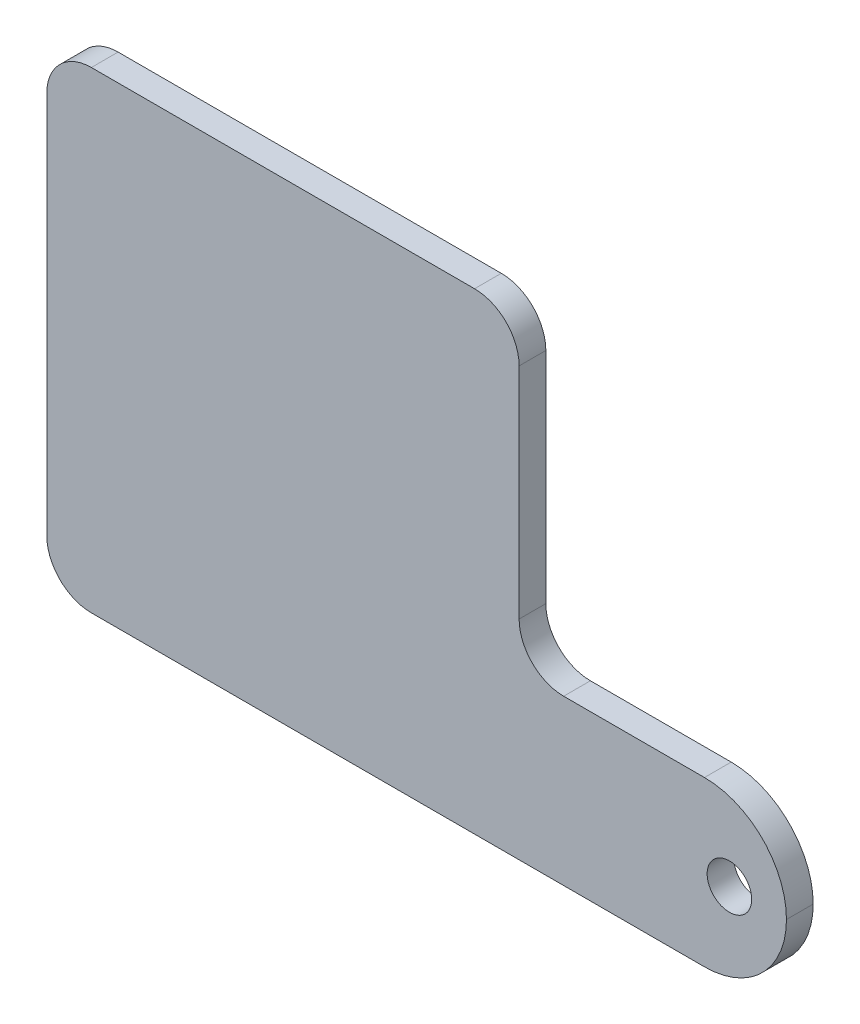
ISO-10303-21;
HEADER;
FILE_DESCRIPTION(('STEP AP214'),'2;1');
FILE_NAME('part.step','',(''),(''),'','','');
FILE_SCHEMA(('AUTOMOTIVE_DESIGN { 1 0 10303 214 1 1 1 1 }'));
ENDSEC;
DATA;
#1=APPLICATION_CONTEXT('core data for automotive mechanical design processes');
#2=APPLICATION_PROTOCOL_DEFINITION('international standard','automotive_design',2000,#1);
#3=PRODUCT_CONTEXT('',#1,'mechanical');
#4=PRODUCT('Part','Part','',(#3));
#5=PRODUCT_RELATED_PRODUCT_CATEGORY('part','',(#4));
#6=PRODUCT_DEFINITION_FORMATION('','',#4);
#7=PRODUCT_DEFINITION_CONTEXT('part definition',#1,'design');
#8=PRODUCT_DEFINITION('design','',#6,#7);
#9=PRODUCT_DEFINITION_SHAPE('','',#8);
#10=(LENGTH_UNIT() NAMED_UNIT(*) SI_UNIT(.MILLI.,.METRE.));
#11=(NAMED_UNIT(*) PLANE_ANGLE_UNIT() SI_UNIT($,.RADIAN.));
#12=(NAMED_UNIT(*) SI_UNIT($,.STERADIAN.) SOLID_ANGLE_UNIT());
#13=UNCERTAINTY_MEASURE_WITH_UNIT(LENGTH_MEASURE(1.E-05),#10,'distance_accuracy_value','');
#14=(GEOMETRIC_REPRESENTATION_CONTEXT(3) GLOBAL_UNCERTAINTY_ASSIGNED_CONTEXT((#13)) GLOBAL_UNIT_ASSIGNED_CONTEXT((#10,
#11,#12)) REPRESENTATION_CONTEXT('',''));
#15=CARTESIAN_POINT('',(0.,0.,0.));
#16=DIRECTION('',(0.,0.,1.));
#17=DIRECTION('',(1.,0.,0.));
#18=AXIS2_PLACEMENT_3D('',#15,#16,#17);
#19=CARTESIAN_POINT('',(0.,0.,3.));
#20=DIRECTION('',(0.,0.,-1.));
#21=DIRECTION('',(-1.,0.,0.));
#22=AXIS2_PLACEMENT_3D('',#19,#20,#21);
#23=PLANE('',#22);
#24=DIRECTION('',(1.,0.,0.));
#25=VECTOR('',#24,1.);
#26=CARTESIAN_POINT('',(0.,0.,3.));
#27=LINE('',#26,#25);
#28=CARTESIAN_POINT('',(5.,0.,3.));
#29=VERTEX_POINT('',#28);
#30=CARTESIAN_POINT('',(73.8,0.,3.));
#31=VERTEX_POINT('',#30);
#32=EDGE_CURVE('E200',#29,#31,#27,.T.);
#33=ORIENTED_EDGE('',*,*,#32,.T.);
#34=CARTESIAN_POINT('',(73.8,9.2,3.));
#35=DIRECTION('',(0.,0.,-1.));
#36=DIRECTION('',(-1.,0.,0.));
#37=AXIS2_PLACEMENT_3D('',#34,#35,#36);
#38=CIRCLE('',#37,9.2);
#39=CARTESIAN_POINT('',(83.,9.2,3.));
#40=VERTEX_POINT('',#39);
#41=EDGE_CURVE('E42',#31,#40,#38,.F.);
#42=ORIENTED_EDGE('',*,*,#41,.T.);
#43=CARTESIAN_POINT('',(73.8,9.2,3.));
#44=DIRECTION('',(0.,0.,-1.));
#45=DIRECTION('',(-1.,0.,0.));
#46=AXIS2_PLACEMENT_3D('',#43,#44,#45);
#47=CIRCLE('',#46,9.2);
#48=CARTESIAN_POINT('',(73.8,18.4,3.));
#49=VERTEX_POINT('',#48);
#50=EDGE_CURVE('E49',#40,#49,#47,.F.);
#51=ORIENTED_EDGE('',*,*,#50,.T.);
#52=DIRECTION('',(-1.,0.,0.));
#53=VECTOR('',#52,1.);
#54=CARTESIAN_POINT('',(53.,18.4,3.));
#55=LINE('',#54,#53);
#56=CARTESIAN_POINT('',(58.,18.4,3.));
#57=VERTEX_POINT('',#56);
#58=EDGE_CURVE('E206',#49,#57,#55,.T.);
#59=ORIENTED_EDGE('',*,*,#58,.T.);
#60=CARTESIAN_POINT('',(58.,23.4,3.));
#61=DIRECTION('',(0.,0.,-1.));
#62=DIRECTION('',(-1.,0.,0.));
#63=AXIS2_PLACEMENT_3D('',#60,#61,#62);
#64=CIRCLE('',#63,5.);
#65=CARTESIAN_POINT('',(53.,23.4,3.));
#66=VERTEX_POINT('',#65);
#67=EDGE_CURVE('E186',#57,#66,#64,.T.);
#68=ORIENTED_EDGE('',*,*,#67,.T.);
#69=DIRECTION('',(0.,1.,0.));
#70=VECTOR('',#69,1.);
#71=CARTESIAN_POINT('',(53.,53.,3.));
#72=LINE('',#71,#70);
#73=CARTESIAN_POINT('',(53.,48.,3.));
#74=VERTEX_POINT('',#73);
#75=EDGE_CURVE('E208',#66,#74,#72,.T.);
#76=ORIENTED_EDGE('',*,*,#75,.T.);
#77=CARTESIAN_POINT('',(48.,48.,3.));
#78=DIRECTION('',(0.,0.,-1.));
#79=DIRECTION('',(-1.,0.,0.));
#80=AXIS2_PLACEMENT_3D('',#77,#78,#79);
#81=CIRCLE('',#80,5.);
#82=CARTESIAN_POINT('',(48.,53.,3.));
#83=VERTEX_POINT('',#82);
#84=EDGE_CURVE('E165',#74,#83,#81,.F.);
#85=ORIENTED_EDGE('',*,*,#84,.T.);
#86=DIRECTION('',(-1.,0.,0.));
#87=VECTOR('',#86,1.);
#88=CARTESIAN_POINT('',(0.,53.,3.));
#89=LINE('',#88,#87);
#90=CARTESIAN_POINT('',(5.,53.,3.));
#91=VERTEX_POINT('',#90);
#92=EDGE_CURVE('E150',#83,#91,#89,.T.);
#93=ORIENTED_EDGE('',*,*,#92,.T.);
#94=CARTESIAN_POINT('',(5.,48.,3.));
#95=DIRECTION('',(0.,0.,-1.));
#96=DIRECTION('',(-1.,0.,0.));
#97=AXIS2_PLACEMENT_3D('',#94,#95,#96);
#98=CIRCLE('',#97,5.);
#99=CARTESIAN_POINT('',(0.,48.,3.));
#100=VERTEX_POINT('',#99);
#101=EDGE_CURVE('E169',#91,#100,#98,.F.);
#102=ORIENTED_EDGE('',*,*,#101,.T.);
#103=DIRECTION('',(0.,-1.,0.));
#104=VECTOR('',#103,1.);
#105=CARTESIAN_POINT('',(0.,0.,3.));
#106=LINE('',#105,#104);
#107=CARTESIAN_POINT('',(0.,5.,3.));
#108=VERTEX_POINT('',#107);
#109=EDGE_CURVE('E133',#100,#108,#106,.T.);
#110=ORIENTED_EDGE('',*,*,#109,.T.);
#111=CARTESIAN_POINT('',(5.,5.,3.));
#112=DIRECTION('',(0.,0.,-1.));
#113=DIRECTION('',(-1.,0.,0.));
#114=AXIS2_PLACEMENT_3D('',#111,#112,#113);
#115=CIRCLE('',#114,5.);
#116=EDGE_CURVE('E167',#108,#29,#115,.F.);
#117=ORIENTED_EDGE('',*,*,#116,.T.);
#118=EDGE_LOOP('',(#33,#42,#51,#59,#68,#76,#85,#93,#102,#110,#117));
#119=FACE_BOUND('',#118,.T.);
#120=CARTESIAN_POINT('',(76.6,9.2,3.));
#121=DIRECTION('',(0.,0.,1.));
#122=DIRECTION('',(1.,0.,0.));
#123=AXIS2_PLACEMENT_3D('',#120,#121,#122);
#124=CIRCLE('',#123,2.5);
#125=CARTESIAN_POINT('',(79.1,9.2,3.));
#126=VERTEX_POINT('',#125);
#127=EDGE_CURVE('E141',#126,#126,#124,.T.);
#128=ORIENTED_EDGE('',*,*,#127,.F.);
#129=EDGE_LOOP('',(#128));
#130=FACE_BOUND('',#129,.T.);
#131=ADVANCED_FACE('F33',(#119,#130),#23,.F.);
#132=CARTESIAN_POINT('',(0.,0.,0.));
#133=DIRECTION('',(0.,0.,-1.));
#134=DIRECTION('',(-1.,0.,0.));
#135=AXIS2_PLACEMENT_3D('',#132,#133,#134);
#136=PLANE('',#135);
#137=CARTESIAN_POINT('',(73.8,9.2,0.));
#138=DIRECTION('',(0.,0.,-1.));
#139=DIRECTION('',(-1.,0.,0.));
#140=AXIS2_PLACEMENT_3D('',#137,#138,#139);
#141=CIRCLE('',#140,9.2);
#142=CARTESIAN_POINT('',(73.8,18.4,0.));
#143=VERTEX_POINT('',#142);
#144=CARTESIAN_POINT('',(83.,9.2,0.));
#145=VERTEX_POINT('',#144);
#146=EDGE_CURVE('E188',#143,#145,#141,.T.);
#147=ORIENTED_EDGE('',*,*,#146,.T.);
#148=CARTESIAN_POINT('',(73.8,9.2,0.));
#149=DIRECTION('',(0.,0.,-1.));
#150=DIRECTION('',(-1.,0.,0.));
#151=AXIS2_PLACEMENT_3D('',#148,#149,#150);
#152=CIRCLE('',#151,9.2);
#153=CARTESIAN_POINT('',(73.8,0.,0.));
#154=VERTEX_POINT('',#153);
#155=EDGE_CURVE('E190',#145,#154,#152,.T.);
#156=ORIENTED_EDGE('',*,*,#155,.T.);
#157=DIRECTION('',(1.,0.,0.));
#158=VECTOR('',#157,1.);
#159=CARTESIAN_POINT('',(0.,0.,0.));
#160=LINE('',#159,#158);
#161=CARTESIAN_POINT('',(5.,0.,0.));
#162=VERTEX_POINT('',#161);
#163=EDGE_CURVE('E140',#162,#154,#160,.T.);
#164=ORIENTED_EDGE('',*,*,#163,.F.);
#165=CARTESIAN_POINT('',(5.,5.,0.));
#166=DIRECTION('',(0.,0.,-1.));
#167=DIRECTION('',(-1.,0.,0.));
#168=AXIS2_PLACEMENT_3D('',#165,#166,#167);
#169=CIRCLE('',#168,5.);
#170=CARTESIAN_POINT('',(0.,5.,0.));
#171=VERTEX_POINT('',#170);
#172=EDGE_CURVE('E124',#162,#171,#169,.T.);
#173=ORIENTED_EDGE('',*,*,#172,.T.);
#174=DIRECTION('',(0.,-1.,0.));
#175=VECTOR('',#174,1.);
#176=CARTESIAN_POINT('',(0.,0.,0.));
#177=LINE('',#176,#175);
#178=CARTESIAN_POINT('',(0.,48.,0.));
#179=VERTEX_POINT('',#178);
#180=EDGE_CURVE('E130',#179,#171,#177,.T.);
#181=ORIENTED_EDGE('',*,*,#180,.F.);
#182=CARTESIAN_POINT('',(5.,48.,0.));
#183=DIRECTION('',(0.,0.,-1.));
#184=DIRECTION('',(-1.,0.,0.));
#185=AXIS2_PLACEMENT_3D('',#182,#183,#184);
#186=CIRCLE('',#185,5.);
#187=CARTESIAN_POINT('',(5.,53.,0.));
#188=VERTEX_POINT('',#187);
#189=EDGE_CURVE('E113',#179,#188,#186,.T.);
#190=ORIENTED_EDGE('',*,*,#189,.T.);
#191=DIRECTION('',(-1.,0.,0.));
#192=VECTOR('',#191,1.);
#193=CARTESIAN_POINT('',(0.,53.,0.));
#194=LINE('',#193,#192);
#195=CARTESIAN_POINT('',(48.,53.,0.));
#196=VERTEX_POINT('',#195);
#197=EDGE_CURVE('E156',#196,#188,#194,.T.);
#198=ORIENTED_EDGE('',*,*,#197,.F.);
#199=CARTESIAN_POINT('',(48.,48.,0.));
#200=DIRECTION('',(0.,0.,-1.));
#201=DIRECTION('',(-1.,0.,0.));
#202=AXIS2_PLACEMENT_3D('',#199,#200,#201);
#203=CIRCLE('',#202,5.);
#204=CARTESIAN_POINT('',(53.,48.,0.));
#205=VERTEX_POINT('',#204);
#206=EDGE_CURVE('E134',#196,#205,#203,.T.);
#207=ORIENTED_EDGE('',*,*,#206,.T.);
#208=DIRECTION('',(0.,1.,0.));
#209=VECTOR('',#208,1.);
#210=CARTESIAN_POINT('',(53.,53.,0.));
#211=LINE('',#210,#209);
#212=CARTESIAN_POINT('',(53.,23.4,0.));
#213=VERTEX_POINT('',#212);
#214=EDGE_CURVE('E154',#213,#205,#211,.T.);
#215=ORIENTED_EDGE('',*,*,#214,.F.);
#216=CARTESIAN_POINT('',(58.,23.4,0.));
#217=DIRECTION('',(0.,0.,-1.));
#218=DIRECTION('',(-1.,0.,0.));
#219=AXIS2_PLACEMENT_3D('',#216,#217,#218);
#220=CIRCLE('',#219,5.);
#221=CARTESIAN_POINT('',(58.,18.4,0.));
#222=VERTEX_POINT('',#221);
#223=EDGE_CURVE('E183',#213,#222,#220,.F.);
#224=ORIENTED_EDGE('',*,*,#223,.T.);
#225=DIRECTION('',(-1.,0.,0.));
#226=VECTOR('',#225,1.);
#227=CARTESIAN_POINT('',(53.,18.4,0.));
#228=LINE('',#227,#226);
#229=EDGE_CURVE('E144',#143,#222,#228,.T.);
#230=ORIENTED_EDGE('',*,*,#229,.F.);
#231=EDGE_LOOP('',(#147,#156,#164,#173,#181,#190,#198,#207,#215,#224,#230));
#232=FACE_BOUND('',#231,.T.);
#233=CARTESIAN_POINT('',(76.6,9.2,0.));
#234=DIRECTION('',(0.,0.,1.));
#235=DIRECTION('',(1.,0.,0.));
#236=AXIS2_PLACEMENT_3D('',#233,#234,#235);
#237=CIRCLE('',#236,2.5);
#238=CARTESIAN_POINT('',(79.1,9.2,0.));
#239=VERTEX_POINT('',#238);
#240=EDGE_CURVE('E147',#239,#239,#237,.T.);
#241=ORIENTED_EDGE('',*,*,#240,.T.);
#242=EDGE_LOOP('',(#241));
#243=FACE_BOUND('',#242,.T.);
#244=ADVANCED_FACE('F137',(#232,#243),#136,.T.);
#245=CARTESIAN_POINT('',(0.,0.,3.));
#246=DIRECTION('',(1.,0.,0.));
#247=DIRECTION('',(0.,0.,-1.));
#248=AXIS2_PLACEMENT_3D('',#245,#246,#247);
#249=PLANE('',#248);
#250=ORIENTED_EDGE('',*,*,#109,.F.);
#251=DIRECTION('',(0.,0.,-1.));
#252=VECTOR('',#251,1.);
#253=CARTESIAN_POINT('',(0.,48.,3.));
#254=LINE('',#253,#252);
#255=EDGE_CURVE('E117',#100,#179,#254,.T.);
#256=ORIENTED_EDGE('',*,*,#255,.T.);
#257=ORIENTED_EDGE('',*,*,#180,.T.);
#258=DIRECTION('',(0.,0.,-1.));
#259=VECTOR('',#258,1.);
#260=CARTESIAN_POINT('',(0.,5.,3.));
#261=LINE('',#260,#259);
#262=EDGE_CURVE('E135',#171,#108,#261,.F.);
#263=ORIENTED_EDGE('',*,*,#262,.T.);
#264=EDGE_LOOP('',(#250,#256,#257,#263));
#265=FACE_BOUND('',#264,.T.);
#266=ADVANCED_FACE('F129',(#265),#249,.F.);
#267=CARTESIAN_POINT('',(0.,0.,3.));
#268=DIRECTION('',(0.,1.,0.));
#269=DIRECTION('',(0.,0.,1.));
#270=AXIS2_PLACEMENT_3D('',#267,#268,#269);
#271=PLANE('',#270);
#272=ORIENTED_EDGE('',*,*,#163,.T.);
#273=DIRECTION('',(0.,0.,-1.));
#274=VECTOR('',#273,1.);
#275=CARTESIAN_POINT('',(73.8,0.,3.));
#276=LINE('',#275,#274);
#277=EDGE_CURVE('E192',#154,#31,#276,.F.);
#278=ORIENTED_EDGE('',*,*,#277,.T.);
#279=ORIENTED_EDGE('',*,*,#32,.F.);
#280=DIRECTION('',(0.,0.,-1.));
#281=VECTOR('',#280,1.);
#282=CARTESIAN_POINT('',(5.,0.,3.));
#283=LINE('',#282,#281);
#284=EDGE_CURVE('E171',#29,#162,#283,.T.);
#285=ORIENTED_EDGE('',*,*,#284,.T.);
#286=EDGE_LOOP('',(#272,#278,#279,#285));
#287=FACE_BOUND('',#286,.T.);
#288=ADVANCED_FACE('F199',(#287),#271,.F.);
#289=CARTESIAN_POINT('',(53.,18.4,3.));
#290=DIRECTION('',(0.,-1.,0.));
#291=DIRECTION('',(0.,0.,-1.));
#292=AXIS2_PLACEMENT_3D('',#289,#290,#291);
#293=PLANE('',#292);
#294=ORIENTED_EDGE('',*,*,#58,.F.);
#295=DIRECTION('',(0.,0.,-1.));
#296=VECTOR('',#295,1.);
#297=CARTESIAN_POINT('',(73.8,18.4,3.));
#298=LINE('',#297,#296);
#299=EDGE_CURVE('E11',#49,#143,#298,.T.);
#300=ORIENTED_EDGE('',*,*,#299,.T.);
#301=ORIENTED_EDGE('',*,*,#229,.T.);
#302=DIRECTION('',(0.,0.,-1.));
#303=VECTOR('',#302,1.);
#304=CARTESIAN_POINT('',(58.,18.4,3.));
#305=LINE('',#304,#303);
#306=EDGE_CURVE('E180',#222,#57,#305,.F.);
#307=ORIENTED_EDGE('',*,*,#306,.T.);
#308=EDGE_LOOP('',(#294,#300,#301,#307));
#309=FACE_BOUND('',#308,.T.);
#310=ADVANCED_FACE('F232',(#309),#293,.F.);
#311=CARTESIAN_POINT('',(53.,53.,3.));
#312=DIRECTION('',(-1.,0.,0.));
#313=DIRECTION('',(0.,-1.,0.));
#314=AXIS2_PLACEMENT_3D('',#311,#312,#313);
#315=PLANE('',#314);
#316=ORIENTED_EDGE('',*,*,#75,.F.);
#317=DIRECTION('',(0.,0.,-1.));
#318=VECTOR('',#317,1.);
#319=CARTESIAN_POINT('',(53.,23.4,0.));
#320=LINE('',#319,#318);
#321=EDGE_CURVE('E177',#66,#213,#320,.T.);
#322=ORIENTED_EDGE('',*,*,#321,.T.);
#323=ORIENTED_EDGE('',*,*,#214,.T.);
#324=DIRECTION('',(0.,0.,-1.));
#325=VECTOR('',#324,1.);
#326=CARTESIAN_POINT('',(53.,48.,3.));
#327=LINE('',#326,#325);
#328=EDGE_CURVE('E174',#205,#74,#327,.F.);
#329=ORIENTED_EDGE('',*,*,#328,.T.);
#330=EDGE_LOOP('',(#316,#322,#323,#329));
#331=FACE_BOUND('',#330,.T.);
#332=ADVANCED_FACE('F226',(#331),#315,.F.);
#333=CARTESIAN_POINT('',(0.,53.,3.));
#334=DIRECTION('',(0.,-1.,0.));
#335=DIRECTION('',(0.,0.,-1.));
#336=AXIS2_PLACEMENT_3D('',#333,#334,#335);
#337=PLANE('',#336);
#338=ORIENTED_EDGE('',*,*,#197,.T.);
#339=DIRECTION('',(0.,0.,-1.));
#340=VECTOR('',#339,1.);
#341=CARTESIAN_POINT('',(5.,53.,3.));
#342=LINE('',#341,#340);
#343=EDGE_CURVE('E118',#188,#91,#342,.F.);
#344=ORIENTED_EDGE('',*,*,#343,.T.);
#345=ORIENTED_EDGE('',*,*,#92,.F.);
#346=DIRECTION('',(0.,0.,-1.));
#347=VECTOR('',#346,1.);
#348=CARTESIAN_POINT('',(48.,53.,3.));
#349=LINE('',#348,#347);
#350=EDGE_CURVE('E123',#83,#196,#349,.T.);
#351=ORIENTED_EDGE('',*,*,#350,.T.);
#352=EDGE_LOOP('',(#338,#344,#345,#351));
#353=FACE_BOUND('',#352,.T.);
#354=ADVANCED_FACE('F218',(#353),#337,.F.);
#355=CARTESIAN_POINT('',(76.6,9.2,3.));
#356=DIRECTION('',(0.,0.,-1.));
#357=DIRECTION('',(-1.,0.,0.));
#358=AXIS2_PLACEMENT_3D('',#355,#356,#357);
#359=CYLINDRICAL_SURFACE('',#358,2.5);
#360=ORIENTED_EDGE('',*,*,#127,.T.);
#361=EDGE_LOOP('',(#360));
#362=FACE_BOUND('',#361,.T.);
#363=ORIENTED_EDGE('',*,*,#240,.F.);
#364=EDGE_LOOP('',(#363));
#365=FACE_BOUND('',#364,.T.);
#366=ADVANCED_FACE('F251',(#362,#365),#359,.F.);
#367=CARTESIAN_POINT('',(5.,48.,3.));
#368=DIRECTION('',(0.,0.,-1.));
#369=DIRECTION('',(-1.,0.,0.));
#370=AXIS2_PLACEMENT_3D('',#367,#368,#369);
#371=CYLINDRICAL_SURFACE('',#370,5.);
#372=ORIENTED_EDGE('',*,*,#101,.F.);
#373=ORIENTED_EDGE('',*,*,#343,.F.);
#374=ORIENTED_EDGE('',*,*,#189,.F.);
#375=ORIENTED_EDGE('',*,*,#255,.F.);
#376=EDGE_LOOP('',(#372,#373,#374,#375));
#377=FACE_BOUND('',#376,.T.);
#378=ADVANCED_FACE('F116',(#377),#371,.T.);
#379=CARTESIAN_POINT('',(5.,5.,3.));
#380=DIRECTION('',(0.,0.,-1.));
#381=DIRECTION('',(-1.,0.,0.));
#382=AXIS2_PLACEMENT_3D('',#379,#380,#381);
#383=CYLINDRICAL_SURFACE('',#382,5.);
#384=ORIENTED_EDGE('',*,*,#116,.F.);
#385=ORIENTED_EDGE('',*,*,#262,.F.);
#386=ORIENTED_EDGE('',*,*,#172,.F.);
#387=ORIENTED_EDGE('',*,*,#284,.F.);
#388=EDGE_LOOP('',(#384,#385,#386,#387));
#389=FACE_BOUND('',#388,.T.);
#390=ADVANCED_FACE('F265',(#389),#383,.T.);
#391=CARTESIAN_POINT('',(48.,48.,3.));
#392=DIRECTION('',(0.,0.,-1.));
#393=DIRECTION('',(-1.,0.,0.));
#394=AXIS2_PLACEMENT_3D('',#391,#392,#393);
#395=CYLINDRICAL_SURFACE('',#394,5.);
#396=ORIENTED_EDGE('',*,*,#84,.F.);
#397=ORIENTED_EDGE('',*,*,#328,.F.);
#398=ORIENTED_EDGE('',*,*,#206,.F.);
#399=ORIENTED_EDGE('',*,*,#350,.F.);
#400=EDGE_LOOP('',(#396,#397,#398,#399));
#401=FACE_BOUND('',#400,.T.);
#402=ADVANCED_FACE('F220',(#401),#395,.T.);
#403=CARTESIAN_POINT('',(58.,23.4,3.));
#404=DIRECTION('',(0.,0.,1.));
#405=DIRECTION('',(1.,0.,0.));
#406=AXIS2_PLACEMENT_3D('',#403,#404,#405);
#407=CYLINDRICAL_SURFACE('',#406,5.);
#408=ORIENTED_EDGE('',*,*,#67,.F.);
#409=ORIENTED_EDGE('',*,*,#306,.F.);
#410=ORIENTED_EDGE('',*,*,#223,.F.);
#411=ORIENTED_EDGE('',*,*,#321,.F.);
#412=EDGE_LOOP('',(#408,#409,#410,#411));
#413=FACE_BOUND('',#412,.T.);
#414=ADVANCED_FACE('F230',(#413),#407,.F.);
#415=CARTESIAN_POINT('',(73.8,9.2,3.));
#416=DIRECTION('',(0.,0.,-1.));
#417=DIRECTION('',(-1.,0.,0.));
#418=AXIS2_PLACEMENT_3D('',#415,#416,#417);
#419=CYLINDRICAL_SURFACE('',#418,9.2);
#420=ORIENTED_EDGE('',*,*,#299,.F.);
#421=ORIENTED_EDGE('',*,*,#50,.F.);
#422=DIRECTION('',(0.,0.,-1.));
#423=VECTOR('',#422,1.);
#424=CARTESIAN_POINT('',(83.,9.2,3.));
#425=LINE('',#424,#423);
#426=EDGE_CURVE('E37',#145,#40,#425,.F.);
#427=ORIENTED_EDGE('',*,*,#426,.F.);
#428=ORIENTED_EDGE('',*,*,#146,.F.);
#429=EDGE_LOOP('',(#420,#421,#427,#428));
#430=FACE_BOUND('',#429,.T.);
#431=ADVANCED_FACE('F35',(#430),#419,.T.);
#432=CARTESIAN_POINT('',(73.8,9.2,3.));
#433=DIRECTION('',(0.,0.,-1.));
#434=DIRECTION('',(-1.,0.,0.));
#435=AXIS2_PLACEMENT_3D('',#432,#433,#434);
#436=CYLINDRICAL_SURFACE('',#435,9.2);
#437=ORIENTED_EDGE('',*,*,#41,.F.);
#438=ORIENTED_EDGE('',*,*,#277,.F.);
#439=ORIENTED_EDGE('',*,*,#155,.F.);
#440=ORIENTED_EDGE('',*,*,#426,.T.);
#441=EDGE_LOOP('',(#437,#438,#439,#440));
#442=FACE_BOUND('',#441,.T.);
#443=ADVANCED_FACE('F238',(#442),#436,.T.);
#444=CLOSED_SHELL('',(#131,#244,#266,#288,#310,#332,#354,#366,#378,#390,#402,#414,#431,#443));
#445=MANIFOLD_SOLID_BREP('B2',#444);
#446=ADVANCED_BREP_SHAPE_REPRESENTATION('',(#18,#445),#14);
#447=SHAPE_DEFINITION_REPRESENTATION(#9,#446);
ENDSEC;
END-ISO-10303-21;
